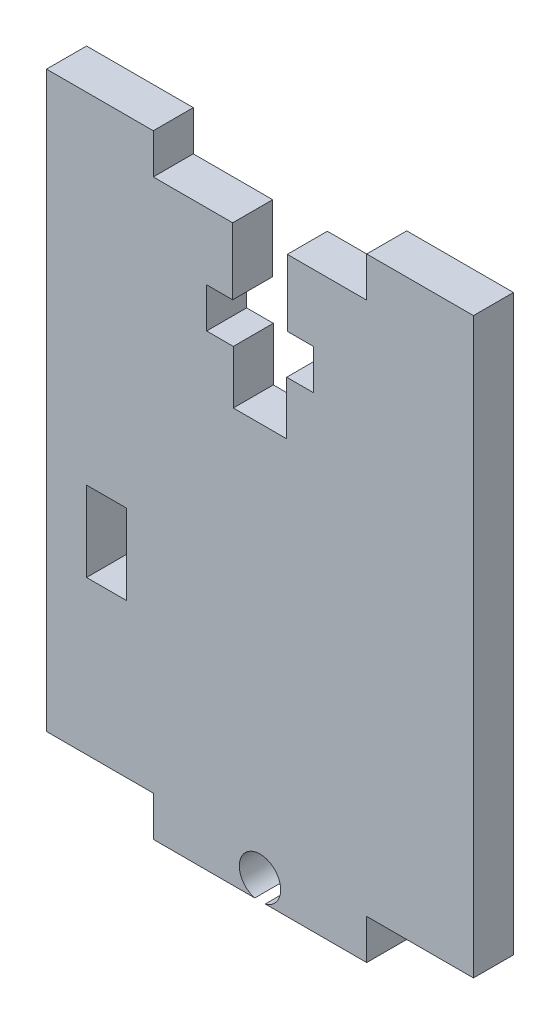
ISO-10303-21;
HEADER;
FILE_DESCRIPTION(('STEP AP214'),'2;1');
FILE_NAME('part.step','',(''),(''),'','','');
FILE_SCHEMA(('AUTOMOTIVE_DESIGN { 1 0 10303 214 1 1 1 1 }'));
ENDSEC;
DATA;
#1=APPLICATION_CONTEXT('core data for automotive mechanical design processes');
#2=APPLICATION_PROTOCOL_DEFINITION('international standard','automotive_design',2000,#1);
#3=PRODUCT_CONTEXT('',#1,'mechanical');
#4=PRODUCT('Part','Part','',(#3));
#5=PRODUCT_RELATED_PRODUCT_CATEGORY('part','',(#4));
#6=PRODUCT_DEFINITION_FORMATION('','',#4);
#7=PRODUCT_DEFINITION_CONTEXT('part definition',#1,'design');
#8=PRODUCT_DEFINITION('design','',#6,#7);
#9=PRODUCT_DEFINITION_SHAPE('','',#8);
#10=(LENGTH_UNIT() NAMED_UNIT(*) SI_UNIT(.MILLI.,.METRE.));
#11=(NAMED_UNIT(*) PLANE_ANGLE_UNIT() SI_UNIT($,.RADIAN.));
#12=(NAMED_UNIT(*) SI_UNIT($,.STERADIAN.) SOLID_ANGLE_UNIT());
#13=UNCERTAINTY_MEASURE_WITH_UNIT(LENGTH_MEASURE(1.E-05),#10,'distance_accuracy_value','');
#14=(GEOMETRIC_REPRESENTATION_CONTEXT(3) GLOBAL_UNCERTAINTY_ASSIGNED_CONTEXT((#13)) GLOBAL_UNIT_ASSIGNED_CONTEXT((#10,
#11,#12)) REPRESENTATION_CONTEXT('',''));
#15=CARTESIAN_POINT('',(0.,0.,0.));
#16=DIRECTION('',(0.,0.,1.));
#17=DIRECTION('',(1.,0.,0.));
#18=AXIS2_PLACEMENT_3D('',#15,#16,#17);
#19=CARTESIAN_POINT('',(0.,7.35530547710422,3.));
#20=DIRECTION('',(0.,0.,1.));
#21=DIRECTION('',(1.,0.,0.));
#22=AXIS2_PLACEMENT_3D('',#19,#20,#21);
#23=PLANE('',#22);
#24=DIRECTION('',(0.,-1.,0.));
#25=VECTOR('',#24,1.);
#26=CARTESIAN_POINT('',(8.,48.8553054771042,3.));
#27=LINE('',#26,#25);
#28=CARTESIAN_POINT('',(8.,51.8553054771042,3.));
#29=VERTEX_POINT('',#28);
#30=CARTESIAN_POINT('',(8.,48.8553054771042,3.));
#31=VERTEX_POINT('',#30);
#32=EDGE_CURVE('E266',#29,#31,#27,.T.);
#33=ORIENTED_EDGE('',*,*,#32,.T.);
#34=DIRECTION('',(-1.,0.,0.));
#35=VECTOR('',#34,1.);
#36=CARTESIAN_POINT('',(2.04789002341845,48.8553054771042,3.));
#37=LINE('',#36,#35);
#38=CARTESIAN_POINT('',(2.04789002341845,48.8553054771042,3.));
#39=VERTEX_POINT('',#38);
#40=EDGE_CURVE('E269',#31,#39,#37,.T.);
#41=ORIENTED_EDGE('',*,*,#40,.T.);
#42=DIRECTION('',(0.,-1.,0.));
#43=VECTOR('',#42,1.);
#44=CARTESIAN_POINT('',(2.04789002341845,48.8553054771042,3.));
#45=LINE('',#44,#43);
#46=CARTESIAN_POINT('',(2.04789002341845,43.8553054771042,3.));
#47=VERTEX_POINT('',#46);
#48=EDGE_CURVE('E272',#39,#47,#45,.T.);
#49=ORIENTED_EDGE('',*,*,#48,.T.);
#50=DIRECTION('',(1.,0.,0.));
#51=VECTOR('',#50,1.);
#52=CARTESIAN_POINT('',(2.04789002341845,43.8553054771042,3.));
#53=LINE('',#52,#51);
#54=CARTESIAN_POINT('',(4.,43.8553054771042,3.));
#55=VERTEX_POINT('',#54);
#56=EDGE_CURVE('E274',#47,#55,#53,.T.);
#57=ORIENTED_EDGE('',*,*,#56,.T.);
#58=DIRECTION('',(0.,-1.,0.));
#59=VECTOR('',#58,1.);
#60=CARTESIAN_POINT('',(4.,43.8553054771042,3.));
#61=LINE('',#60,#59);
#62=CARTESIAN_POINT('',(4.,40.8553054771042,3.));
#63=VERTEX_POINT('',#62);
#64=EDGE_CURVE('E276',#55,#63,#61,.T.);
#65=ORIENTED_EDGE('',*,*,#64,.T.);
#66=DIRECTION('',(-1.,0.,0.));
#67=VECTOR('',#66,1.);
#68=CARTESIAN_POINT('',(4.,40.8553054771042,3.));
#69=LINE('',#68,#67);
#70=CARTESIAN_POINT('',(2.,40.8553054771042,3.));
#71=VERTEX_POINT('',#70);
#72=EDGE_CURVE('E278',#63,#71,#69,.T.);
#73=ORIENTED_EDGE('',*,*,#72,.T.);
#74=DIRECTION('',(0.,-1.,0.));
#75=VECTOR('',#74,1.);
#76=CARTESIAN_POINT('',(2.,40.8553054771042,3.));
#77=LINE('',#76,#75);
#78=CARTESIAN_POINT('',(2.,36.8553054771042,3.));
#79=VERTEX_POINT('',#78);
#80=EDGE_CURVE('E280',#71,#79,#77,.T.);
#81=ORIENTED_EDGE('',*,*,#80,.T.);
#82=DIRECTION('',(-1.,0.,0.));
#83=VECTOR('',#82,1.);
#84=CARTESIAN_POINT('',(2.,36.8553054771042,3.));
#85=LINE('',#84,#83);
#86=CARTESIAN_POINT('',(-2.,36.8553054771042,3.));
#87=VERTEX_POINT('',#86);
#88=EDGE_CURVE('E282',#79,#87,#85,.T.);
#89=ORIENTED_EDGE('',*,*,#88,.T.);
#90=DIRECTION('',(0.,1.,0.));
#91=VECTOR('',#90,1.);
#92=CARTESIAN_POINT('',(-2.,40.8553054771042,3.));
#93=LINE('',#92,#91);
#94=CARTESIAN_POINT('',(-2.,40.8553054771042,3.));
#95=VERTEX_POINT('',#94);
#96=EDGE_CURVE('E284',#87,#95,#93,.T.);
#97=ORIENTED_EDGE('',*,*,#96,.T.);
#98=DIRECTION('',(-1.,0.,0.));
#99=VECTOR('',#98,1.);
#100=CARTESIAN_POINT('',(-4.00000000000001,40.8553054771042,3.));
#101=LINE('',#100,#99);
#102=CARTESIAN_POINT('',(-4.00000000000001,40.8553054771042,3.));
#103=VERTEX_POINT('',#102);
#104=EDGE_CURVE('E286',#95,#103,#101,.T.);
#105=ORIENTED_EDGE('',*,*,#104,.T.);
#106=DIRECTION('',(0.,1.,0.));
#107=VECTOR('',#106,1.);
#108=CARTESIAN_POINT('',(-4.,43.8553054771042,3.));
#109=LINE('',#108,#107);
#110=CARTESIAN_POINT('',(-4.,43.8553054771042,3.));
#111=VERTEX_POINT('',#110);
#112=EDGE_CURVE('E288',#103,#111,#109,.T.);
#113=ORIENTED_EDGE('',*,*,#112,.T.);
#114=DIRECTION('',(1.,0.,0.));
#115=VECTOR('',#114,1.);
#116=CARTESIAN_POINT('',(-2.04789002341846,43.8553054771042,3.));
#117=LINE('',#116,#115);
#118=CARTESIAN_POINT('',(-2.04789002341846,43.8553054771042,3.));
#119=VERTEX_POINT('',#118);
#120=EDGE_CURVE('E290',#111,#119,#117,.T.);
#121=ORIENTED_EDGE('',*,*,#120,.T.);
#122=DIRECTION('',(0.,1.,0.));
#123=VECTOR('',#122,1.);
#124=CARTESIAN_POINT('',(-2.04789002341846,48.8553054771042,3.));
#125=LINE('',#124,#123);
#126=CARTESIAN_POINT('',(-2.04789002341846,48.8553054771042,3.));
#127=VERTEX_POINT('',#126);
#128=EDGE_CURVE('E292',#119,#127,#125,.T.);
#129=ORIENTED_EDGE('',*,*,#128,.T.);
#130=DIRECTION('',(-1.,0.,0.));
#131=VECTOR('',#130,1.);
#132=CARTESIAN_POINT('',(-2.04789002341846,48.8553054771042,3.));
#133=LINE('',#132,#131);
#134=CARTESIAN_POINT('',(-8.00000000000001,48.8553054771042,3.));
#135=VERTEX_POINT('',#134);
#136=EDGE_CURVE('E294',#127,#135,#133,.T.);
#137=ORIENTED_EDGE('',*,*,#136,.T.);
#138=DIRECTION('',(0.,1.,0.));
#139=VECTOR('',#138,1.);
#140=CARTESIAN_POINT('',(-8.00000000000001,48.8553054771042,3.));
#141=LINE('',#140,#139);
#142=CARTESIAN_POINT('',(-8.00000000000001,51.8553054771042,3.));
#143=VERTEX_POINT('',#142);
#144=EDGE_CURVE('E296',#135,#143,#141,.T.);
#145=ORIENTED_EDGE('',*,*,#144,.T.);
#146=DIRECTION('',(-1.,0.,0.));
#147=VECTOR('',#146,1.);
#148=CARTESIAN_POINT('',(-8.00000000000001,51.8553054771042,3.));
#149=LINE('',#148,#147);
#150=CARTESIAN_POINT('',(-16.,51.8553054771042,3.));
#151=VERTEX_POINT('',#150);
#152=EDGE_CURVE('E298',#143,#151,#149,.T.);
#153=ORIENTED_EDGE('',*,*,#152,.T.);
#154=DIRECTION('',(0.,-1.,0.));
#155=VECTOR('',#154,1.);
#156=CARTESIAN_POINT('',(-16.,51.8553054771042,3.));
#157=LINE('',#156,#155);
#158=CARTESIAN_POINT('',(-16.,8.85530547710422,3.));
#159=VERTEX_POINT('',#158);
#160=EDGE_CURVE('E300',#151,#159,#157,.T.);
#161=ORIENTED_EDGE('',*,*,#160,.T.);
#162=DIRECTION('',(1.,0.,0.));
#163=VECTOR('',#162,1.);
#164=CARTESIAN_POINT('',(-16.,8.85530547710422,3.));
#165=LINE('',#164,#163);
#166=CARTESIAN_POINT('',(-8.00000000000001,8.85530547710422,3.));
#167=VERTEX_POINT('',#166);
#168=EDGE_CURVE('E302',#159,#167,#165,.T.);
#169=ORIENTED_EDGE('',*,*,#168,.T.);
#170=DIRECTION('',(0.,-1.,0.));
#171=VECTOR('',#170,1.);
#172=CARTESIAN_POINT('',(-8.00000000000001,5.85530547710422,3.));
#173=LINE('',#172,#171);
#174=CARTESIAN_POINT('',(-8.00000000000001,5.85530547710422,3.));
#175=VERTEX_POINT('',#174);
#176=EDGE_CURVE('E304',#167,#175,#173,.T.);
#177=ORIENTED_EDGE('',*,*,#176,.T.);
#178=DIRECTION('',(1.,0.,0.));
#179=VECTOR('',#178,1.);
#180=CARTESIAN_POINT('',(-8.00000000000001,5.85530547710422,3.));
#181=LINE('',#180,#179);
#182=CARTESIAN_POINT('',(-0.390512483795329,5.85530547710422,3.));
#183=VERTEX_POINT('',#182);
#184=EDGE_CURVE('E306',#175,#183,#181,.T.);
#185=ORIENTED_EDGE('',*,*,#184,.T.);
#186=CARTESIAN_POINT('',(0.,7.35530547710422,3.));
#187=DIRECTION('',(0.,0.,-1.));
#188=DIRECTION('',(1.,0.,0.));
#189=AXIS2_PLACEMENT_3D('',#186,#187,#188);
#190=CIRCLE('',#189,1.55);
#191=CARTESIAN_POINT('',(0.390512483795352,5.85530547710422,3.));
#192=VERTEX_POINT('',#191);
#193=EDGE_CURVE('E308',#183,#192,#190,.T.);
#194=ORIENTED_EDGE('',*,*,#193,.T.);
#195=DIRECTION('',(1.,0.,0.));
#196=VECTOR('',#195,1.);
#197=CARTESIAN_POINT('',(0.390512483795352,5.85530547710422,3.));
#198=LINE('',#197,#196);
#199=CARTESIAN_POINT('',(8.00000000000004,5.85530547710422,3.));
#200=VERTEX_POINT('',#199);
#201=EDGE_CURVE('E310',#192,#200,#198,.T.);
#202=ORIENTED_EDGE('',*,*,#201,.T.);
#203=DIRECTION('',(0.,1.,0.));
#204=VECTOR('',#203,1.);
#205=CARTESIAN_POINT('',(8.00000000000004,5.85530547710422,3.));
#206=LINE('',#205,#204);
#207=CARTESIAN_POINT('',(8.00000000000004,8.85530547710422,3.));
#208=VERTEX_POINT('',#207);
#209=EDGE_CURVE('E312',#200,#208,#206,.T.);
#210=ORIENTED_EDGE('',*,*,#209,.T.);
#211=DIRECTION('',(1.,0.,0.));
#212=VECTOR('',#211,1.);
#213=CARTESIAN_POINT('',(16.,8.85530547710422,3.));
#214=LINE('',#213,#212);
#215=CARTESIAN_POINT('',(16.,8.85530547710422,3.));
#216=VERTEX_POINT('',#215);
#217=EDGE_CURVE('E314',#208,#216,#214,.T.);
#218=ORIENTED_EDGE('',*,*,#217,.T.);
#219=DIRECTION('',(0.,1.,0.));
#220=VECTOR('',#219,1.);
#221=CARTESIAN_POINT('',(16.,51.8553054771042,3.));
#222=LINE('',#221,#220);
#223=CARTESIAN_POINT('',(16.,51.8553054771042,3.));
#224=VERTEX_POINT('',#223);
#225=EDGE_CURVE('E316',#216,#224,#222,.T.);
#226=ORIENTED_EDGE('',*,*,#225,.T.);
#227=DIRECTION('',(-1.,0.,0.));
#228=VECTOR('',#227,1.);
#229=CARTESIAN_POINT('',(8.,51.8553054771042,3.));
#230=LINE('',#229,#228);
#231=EDGE_CURVE('E318',#224,#29,#230,.T.);
#232=ORIENTED_EDGE('',*,*,#231,.T.);
#233=EDGE_LOOP('',(#33,#41,#49,#57,#65,#73,#81,#89,#97,#105,#113,#121,#129,#137,#145,#153,#161,
#169,#177,#185,#194,#202,#210,#218,#226,#232));
#234=FACE_BOUND('',#233,.T.);
#235=DIRECTION('',(1.,0.,0.));
#236=VECTOR('',#235,1.);
#237=CARTESIAN_POINT('',(-13.,20.3553054771042,3.));
#238=LINE('',#237,#236);
#239=CARTESIAN_POINT('',(-13.,20.3553054771042,3.));
#240=VERTEX_POINT('',#239);
#241=CARTESIAN_POINT('',(-9.99999999999999,20.3553054771042,3.));
#242=VERTEX_POINT('',#241);
#243=EDGE_CURVE('E238',#240,#242,#238,.T.);
#244=ORIENTED_EDGE('',*,*,#243,.F.);
#245=DIRECTION('',(0.,-1.,0.));
#246=VECTOR('',#245,1.);
#247=CARTESIAN_POINT('',(-13.,20.3553054771042,3.));
#248=LINE('',#247,#246);
#249=CARTESIAN_POINT('',(-13.,26.3553054771042,3.));
#250=VERTEX_POINT('',#249);
#251=EDGE_CURVE('E230',#250,#240,#248,.T.);
#252=ORIENTED_EDGE('',*,*,#251,.F.);
#253=DIRECTION('',(-1.,0.,0.));
#254=VECTOR('',#253,1.);
#255=CARTESIAN_POINT('',(-13.,26.3553054771042,3.));
#256=LINE('',#255,#254);
#257=CARTESIAN_POINT('',(-9.99999999999999,26.3553054771042,3.));
#258=VERTEX_POINT('',#257);
#259=EDGE_CURVE('E252',#258,#250,#256,.T.);
#260=ORIENTED_EDGE('',*,*,#259,.F.);
#261=DIRECTION('',(0.,1.,0.));
#262=VECTOR('',#261,1.);
#263=CARTESIAN_POINT('',(-9.99999999999999,20.3553054771042,3.));
#264=LINE('',#263,#262);
#265=EDGE_CURVE('E250',#242,#258,#264,.T.);
#266=ORIENTED_EDGE('',*,*,#265,.F.);
#267=EDGE_LOOP('',(#244,#252,#260,#266));
#268=FACE_BOUND('',#267,.T.);
#269=ADVANCED_FACE('F33',(#234,#268),#23,.T.);
#270=CARTESIAN_POINT('',(0.,7.35530547710422,0.));
#271=DIRECTION('',(0.,0.,1.));
#272=DIRECTION('',(1.,0.,0.));
#273=AXIS2_PLACEMENT_3D('',#270,#271,#272);
#274=PLANE('',#273);
#275=DIRECTION('',(0.,-1.,0.));
#276=VECTOR('',#275,1.);
#277=CARTESIAN_POINT('',(8.,48.8553054771042,0.));
#278=LINE('',#277,#276);
#279=CARTESIAN_POINT('',(8.,51.8553054771042,0.));
#280=VERTEX_POINT('',#279);
#281=CARTESIAN_POINT('',(8.,48.8553054771042,0.));
#282=VERTEX_POINT('',#281);
#283=EDGE_CURVE('E246',#280,#282,#278,.T.);
#284=ORIENTED_EDGE('',*,*,#283,.F.);
#285=DIRECTION('',(-1.,0.,0.));
#286=VECTOR('',#285,1.);
#287=CARTESIAN_POINT('',(8.,51.8553054771042,0.));
#288=LINE('',#287,#286);
#289=CARTESIAN_POINT('',(16.,51.8553054771042,0.));
#290=VERTEX_POINT('',#289);
#291=EDGE_CURVE('E270',#290,#280,#288,.T.);
#292=ORIENTED_EDGE('',*,*,#291,.F.);
#293=DIRECTION('',(0.,1.,0.));
#294=VECTOR('',#293,1.);
#295=CARTESIAN_POINT('',(16.,51.8553054771042,0.));
#296=LINE('',#295,#294);
#297=CARTESIAN_POINT('',(16.,8.85530547710422,0.));
#298=VERTEX_POINT('',#297);
#299=EDGE_CURVE('E369',#298,#290,#296,.T.);
#300=ORIENTED_EDGE('',*,*,#299,.F.);
#301=DIRECTION('',(1.,0.,0.));
#302=VECTOR('',#301,1.);
#303=CARTESIAN_POINT('',(16.,8.85530547710422,0.));
#304=LINE('',#303,#302);
#305=CARTESIAN_POINT('',(8.00000000000004,8.85530547710422,0.));
#306=VERTEX_POINT('',#305);
#307=EDGE_CURVE('E367',#306,#298,#304,.T.);
#308=ORIENTED_EDGE('',*,*,#307,.F.);
#309=DIRECTION('',(0.,1.,0.));
#310=VECTOR('',#309,1.);
#311=CARTESIAN_POINT('',(8.00000000000004,5.85530547710422,0.));
#312=LINE('',#311,#310);
#313=CARTESIAN_POINT('',(8.00000000000004,5.85530547710422,0.));
#314=VERTEX_POINT('',#313);
#315=EDGE_CURVE('E365',#314,#306,#312,.T.);
#316=ORIENTED_EDGE('',*,*,#315,.F.);
#317=DIRECTION('',(1.,0.,0.));
#318=VECTOR('',#317,1.);
#319=CARTESIAN_POINT('',(0.390512483795352,5.85530547710422,0.));
#320=LINE('',#319,#318);
#321=CARTESIAN_POINT('',(0.390512483795352,5.85530547710422,0.));
#322=VERTEX_POINT('',#321);
#323=EDGE_CURVE('E363',#322,#314,#320,.T.);
#324=ORIENTED_EDGE('',*,*,#323,.F.);
#325=CARTESIAN_POINT('',(0.,7.35530547710422,0.));
#326=DIRECTION('',(0.,0.,-1.));
#327=DIRECTION('',(1.,0.,0.));
#328=AXIS2_PLACEMENT_3D('',#325,#326,#327);
#329=CIRCLE('',#328,1.55);
#330=CARTESIAN_POINT('',(-0.390512483795329,5.85530547710422,0.));
#331=VERTEX_POINT('',#330);
#332=EDGE_CURVE('E361',#331,#322,#329,.T.);
#333=ORIENTED_EDGE('',*,*,#332,.F.);
#334=DIRECTION('',(1.,0.,0.));
#335=VECTOR('',#334,1.);
#336=CARTESIAN_POINT('',(-8.00000000000001,5.85530547710422,0.));
#337=LINE('',#336,#335);
#338=CARTESIAN_POINT('',(-8.00000000000001,5.85530547710422,0.));
#339=VERTEX_POINT('',#338);
#340=EDGE_CURVE('E359',#339,#331,#337,.T.);
#341=ORIENTED_EDGE('',*,*,#340,.F.);
#342=DIRECTION('',(0.,-1.,0.));
#343=VECTOR('',#342,1.);
#344=CARTESIAN_POINT('',(-8.00000000000001,5.85530547710422,0.));
#345=LINE('',#344,#343);
#346=CARTESIAN_POINT('',(-8.00000000000001,8.85530547710422,0.));
#347=VERTEX_POINT('',#346);
#348=EDGE_CURVE('E357',#347,#339,#345,.T.);
#349=ORIENTED_EDGE('',*,*,#348,.F.);
#350=DIRECTION('',(1.,0.,0.));
#351=VECTOR('',#350,1.);
#352=CARTESIAN_POINT('',(-16.,8.85530547710422,0.));
#353=LINE('',#352,#351);
#354=CARTESIAN_POINT('',(-16.,8.85530547710422,0.));
#355=VERTEX_POINT('',#354);
#356=EDGE_CURVE('E355',#355,#347,#353,.T.);
#357=ORIENTED_EDGE('',*,*,#356,.F.);
#358=DIRECTION('',(0.,-1.,0.));
#359=VECTOR('',#358,1.);
#360=CARTESIAN_POINT('',(-16.,51.8553054771042,0.));
#361=LINE('',#360,#359);
#362=CARTESIAN_POINT('',(-16.,51.8553054771042,0.));
#363=VERTEX_POINT('',#362);
#364=EDGE_CURVE('E353',#363,#355,#361,.T.);
#365=ORIENTED_EDGE('',*,*,#364,.F.);
#366=DIRECTION('',(-1.,0.,0.));
#367=VECTOR('',#366,1.);
#368=CARTESIAN_POINT('',(-8.00000000000001,51.8553054771042,0.));
#369=LINE('',#368,#367);
#370=CARTESIAN_POINT('',(-8.00000000000001,51.8553054771042,0.));
#371=VERTEX_POINT('',#370);
#372=EDGE_CURVE('E351',#371,#363,#369,.T.);
#373=ORIENTED_EDGE('',*,*,#372,.F.);
#374=DIRECTION('',(0.,1.,0.));
#375=VECTOR('',#374,1.);
#376=CARTESIAN_POINT('',(-8.00000000000001,48.8553054771042,0.));
#377=LINE('',#376,#375);
#378=CARTESIAN_POINT('',(-8.00000000000001,48.8553054771042,0.));
#379=VERTEX_POINT('',#378);
#380=EDGE_CURVE('E349',#379,#371,#377,.T.);
#381=ORIENTED_EDGE('',*,*,#380,.F.);
#382=DIRECTION('',(-1.,0.,0.));
#383=VECTOR('',#382,1.);
#384=CARTESIAN_POINT('',(-2.04789002341846,48.8553054771042,0.));
#385=LINE('',#384,#383);
#386=CARTESIAN_POINT('',(-2.04789002341846,48.8553054771042,0.));
#387=VERTEX_POINT('',#386);
#388=EDGE_CURVE('E347',#387,#379,#385,.T.);
#389=ORIENTED_EDGE('',*,*,#388,.F.);
#390=DIRECTION('',(0.,1.,0.));
#391=VECTOR('',#390,1.);
#392=CARTESIAN_POINT('',(-2.04789002341846,48.8553054771042,0.));
#393=LINE('',#392,#391);
#394=CARTESIAN_POINT('',(-2.04789002341846,43.8553054771042,0.));
#395=VERTEX_POINT('',#394);
#396=EDGE_CURVE('E345',#395,#387,#393,.T.);
#397=ORIENTED_EDGE('',*,*,#396,.F.);
#398=DIRECTION('',(1.,0.,0.));
#399=VECTOR('',#398,1.);
#400=CARTESIAN_POINT('',(-2.04789002341846,43.8553054771042,0.));
#401=LINE('',#400,#399);
#402=CARTESIAN_POINT('',(-4.,43.8553054771042,0.));
#403=VERTEX_POINT('',#402);
#404=EDGE_CURVE('E343',#403,#395,#401,.T.);
#405=ORIENTED_EDGE('',*,*,#404,.F.);
#406=DIRECTION('',(0.,1.,0.));
#407=VECTOR('',#406,1.);
#408=CARTESIAN_POINT('',(-4.,43.8553054771042,0.));
#409=LINE('',#408,#407);
#410=CARTESIAN_POINT('',(-4.00000000000001,40.8553054771042,0.));
#411=VERTEX_POINT('',#410);
#412=EDGE_CURVE('E341',#411,#403,#409,.T.);
#413=ORIENTED_EDGE('',*,*,#412,.F.);
#414=DIRECTION('',(-1.,0.,0.));
#415=VECTOR('',#414,1.);
#416=CARTESIAN_POINT('',(-4.00000000000001,40.8553054771042,0.));
#417=LINE('',#416,#415);
#418=CARTESIAN_POINT('',(-2.,40.8553054771042,0.));
#419=VERTEX_POINT('',#418);
#420=EDGE_CURVE('E339',#419,#411,#417,.T.);
#421=ORIENTED_EDGE('',*,*,#420,.F.);
#422=DIRECTION('',(0.,1.,0.));
#423=VECTOR('',#422,1.);
#424=CARTESIAN_POINT('',(-2.,40.8553054771042,0.));
#425=LINE('',#424,#423);
#426=CARTESIAN_POINT('',(-2.,36.8553054771042,0.));
#427=VERTEX_POINT('',#426);
#428=EDGE_CURVE('E337',#427,#419,#425,.T.);
#429=ORIENTED_EDGE('',*,*,#428,.F.);
#430=DIRECTION('',(-1.,0.,0.));
#431=VECTOR('',#430,1.);
#432=CARTESIAN_POINT('',(2.,36.8553054771042,0.));
#433=LINE('',#432,#431);
#434=CARTESIAN_POINT('',(2.,36.8553054771042,0.));
#435=VERTEX_POINT('',#434);
#436=EDGE_CURVE('E335',#435,#427,#433,.T.);
#437=ORIENTED_EDGE('',*,*,#436,.F.);
#438=DIRECTION('',(0.,-1.,0.));
#439=VECTOR('',#438,1.);
#440=CARTESIAN_POINT('',(2.,40.8553054771042,0.));
#441=LINE('',#440,#439);
#442=CARTESIAN_POINT('',(2.,40.8553054771042,0.));
#443=VERTEX_POINT('',#442);
#444=EDGE_CURVE('E333',#443,#435,#441,.T.);
#445=ORIENTED_EDGE('',*,*,#444,.F.);
#446=DIRECTION('',(-1.,0.,0.));
#447=VECTOR('',#446,1.);
#448=CARTESIAN_POINT('',(4.,40.8553054771042,0.));
#449=LINE('',#448,#447);
#450=CARTESIAN_POINT('',(4.,40.8553054771042,0.));
#451=VERTEX_POINT('',#450);
#452=EDGE_CURVE('E331',#451,#443,#449,.T.);
#453=ORIENTED_EDGE('',*,*,#452,.F.);
#454=DIRECTION('',(0.,-1.,0.));
#455=VECTOR('',#454,1.);
#456=CARTESIAN_POINT('',(4.,43.8553054771042,0.));
#457=LINE('',#456,#455);
#458=CARTESIAN_POINT('',(4.,43.8553054771042,0.));
#459=VERTEX_POINT('',#458);
#460=EDGE_CURVE('E329',#459,#451,#457,.T.);
#461=ORIENTED_EDGE('',*,*,#460,.F.);
#462=DIRECTION('',(1.,0.,0.));
#463=VECTOR('',#462,1.);
#464=CARTESIAN_POINT('',(2.04789002341845,43.8553054771042,0.));
#465=LINE('',#464,#463);
#466=CARTESIAN_POINT('',(2.04789002341845,43.8553054771042,0.));
#467=VERTEX_POINT('',#466);
#468=EDGE_CURVE('E327',#467,#459,#465,.T.);
#469=ORIENTED_EDGE('',*,*,#468,.F.);
#470=DIRECTION('',(0.,-1.,0.));
#471=VECTOR('',#470,1.);
#472=CARTESIAN_POINT('',(2.04789002341845,48.8553054771042,0.));
#473=LINE('',#472,#471);
#474=CARTESIAN_POINT('',(2.04789002341845,48.8553054771042,0.));
#475=VERTEX_POINT('',#474);
#476=EDGE_CURVE('E325',#475,#467,#473,.T.);
#477=ORIENTED_EDGE('',*,*,#476,.F.);
#478=DIRECTION('',(-1.,0.,0.));
#479=VECTOR('',#478,1.);
#480=CARTESIAN_POINT('',(2.04789002341845,48.8553054771042,0.));
#481=LINE('',#480,#479);
#482=EDGE_CURVE('E323',#282,#475,#481,.T.);
#483=ORIENTED_EDGE('',*,*,#482,.F.);
#484=EDGE_LOOP('',(#284,#292,#300,#308,#316,#324,#333,#341,#349,#357,#365,#373,#381,#389,#397,
#405,#413,#421,#429,#437,#445,#453,#461,#469,#477,#483));
#485=FACE_BOUND('',#484,.T.);
#486=DIRECTION('',(0.,-1.,0.));
#487=VECTOR('',#486,1.);
#488=CARTESIAN_POINT('',(-13.,20.3553054771042,0.));
#489=LINE('',#488,#487);
#490=CARTESIAN_POINT('',(-13.,26.3553054771042,0.));
#491=VERTEX_POINT('',#490);
#492=CARTESIAN_POINT('',(-13.,20.3553054771042,0.));
#493=VERTEX_POINT('',#492);
#494=EDGE_CURVE('E56',#491,#493,#489,.T.);
#495=ORIENTED_EDGE('',*,*,#494,.T.);
#496=DIRECTION('',(1.,0.,0.));
#497=VECTOR('',#496,1.);
#498=CARTESIAN_POINT('',(-13.,20.3553054771042,0.));
#499=LINE('',#498,#497);
#500=CARTESIAN_POINT('',(-9.99999999999999,20.3553054771042,0.));
#501=VERTEX_POINT('',#500);
#502=EDGE_CURVE('E245',#493,#501,#499,.T.);
#503=ORIENTED_EDGE('',*,*,#502,.T.);
#504=DIRECTION('',(0.,1.,0.));
#505=VECTOR('',#504,1.);
#506=CARTESIAN_POINT('',(-9.99999999999999,20.3553054771042,0.));
#507=LINE('',#506,#505);
#508=CARTESIAN_POINT('',(-9.99999999999999,26.3553054771042,0.));
#509=VERTEX_POINT('',#508);
#510=EDGE_CURVE('E258',#501,#509,#507,.T.);
#511=ORIENTED_EDGE('',*,*,#510,.T.);
#512=DIRECTION('',(-1.,0.,0.));
#513=VECTOR('',#512,1.);
#514=CARTESIAN_POINT('',(-13.,26.3553054771042,0.));
#515=LINE('',#514,#513);
#516=EDGE_CURVE('E239',#509,#491,#515,.T.);
#517=ORIENTED_EDGE('',*,*,#516,.T.);
#518=EDGE_LOOP('',(#495,#503,#511,#517));
#519=FACE_BOUND('',#518,.T.);
#520=ADVANCED_FACE('F453',(#485,#519),#274,.F.);
#521=CARTESIAN_POINT('',(8.,48.8553054771042,3.));
#522=DIRECTION('',(1.,0.,0.));
#523=DIRECTION('',(0.,0.,-1.));
#524=AXIS2_PLACEMENT_3D('',#521,#522,#523);
#525=PLANE('',#524);
#526=ORIENTED_EDGE('',*,*,#283,.T.);
#527=DIRECTION('',(0.,0.,-1.));
#528=VECTOR('',#527,1.);
#529=CARTESIAN_POINT('',(8.,48.8553054771042,3.));
#530=LINE('',#529,#528);
#531=EDGE_CURVE('E11',#31,#282,#530,.T.);
#532=ORIENTED_EDGE('',*,*,#531,.F.);
#533=ORIENTED_EDGE('',*,*,#32,.F.);
#534=DIRECTION('',(0.,0.,-1.));
#535=VECTOR('',#534,1.);
#536=CARTESIAN_POINT('',(8.,51.8553054771042,3.));
#537=LINE('',#536,#535);
#538=EDGE_CURVE('E320',#29,#280,#537,.T.);
#539=ORIENTED_EDGE('',*,*,#538,.T.);
#540=EDGE_LOOP('',(#526,#532,#533,#539));
#541=FACE_BOUND('',#540,.T.);
#542=ADVANCED_FACE('F35',(#541),#525,.F.);
#543=CARTESIAN_POINT('',(2.04789002341845,48.8553054771042,3.));
#544=DIRECTION('',(0.,-1.,0.));
#545=DIRECTION('',(0.,0.,-1.));
#546=AXIS2_PLACEMENT_3D('',#543,#544,#545);
#547=PLANE('',#546);
#548=ORIENTED_EDGE('',*,*,#482,.T.);
#549=DIRECTION('',(0.,0.,-1.));
#550=VECTOR('',#549,1.);
#551=CARTESIAN_POINT('',(2.04789002341845,48.8553054771042,3.));
#552=LINE('',#551,#550);
#553=EDGE_CURVE('E41',#39,#475,#552,.T.);
#554=ORIENTED_EDGE('',*,*,#553,.F.);
#555=ORIENTED_EDGE('',*,*,#40,.F.);
#556=ORIENTED_EDGE('',*,*,#531,.T.);
#557=EDGE_LOOP('',(#548,#554,#555,#556));
#558=FACE_BOUND('',#557,.T.);
#559=ADVANCED_FACE('F470',(#558),#547,.F.);
#560=CARTESIAN_POINT('',(2.04789002341845,48.8553054771042,3.));
#561=DIRECTION('',(1.,0.,0.));
#562=DIRECTION('',(0.,1.,0.));
#563=AXIS2_PLACEMENT_3D('',#560,#561,#562);
#564=PLANE('',#563);
#565=ORIENTED_EDGE('',*,*,#476,.T.);
#566=DIRECTION('',(0.,0.,-1.));
#567=VECTOR('',#566,1.);
#568=CARTESIAN_POINT('',(2.04789002341845,43.8553054771042,3.));
#569=LINE('',#568,#567);
#570=EDGE_CURVE('E440',#47,#467,#569,.T.);
#571=ORIENTED_EDGE('',*,*,#570,.F.);
#572=ORIENTED_EDGE('',*,*,#48,.F.);
#573=ORIENTED_EDGE('',*,*,#553,.T.);
#574=EDGE_LOOP('',(#565,#571,#572,#573));
#575=FACE_BOUND('',#574,.T.);
#576=ADVANCED_FACE('F447',(#575),#564,.F.);
#577=CARTESIAN_POINT('',(2.04789002341845,43.8553054771042,3.));
#578=DIRECTION('',(0.,1.,0.));
#579=DIRECTION('',(-1.,0.,0.));
#580=AXIS2_PLACEMENT_3D('',#577,#578,#579);
#581=PLANE('',#580);
#582=ORIENTED_EDGE('',*,*,#468,.T.);
#583=DIRECTION('',(0.,0.,-1.));
#584=VECTOR('',#583,1.);
#585=CARTESIAN_POINT('',(4.,43.8553054771042,3.));
#586=LINE('',#585,#584);
#587=EDGE_CURVE('E437',#55,#459,#586,.T.);
#588=ORIENTED_EDGE('',*,*,#587,.F.);
#589=ORIENTED_EDGE('',*,*,#56,.F.);
#590=ORIENTED_EDGE('',*,*,#570,.T.);
#591=EDGE_LOOP('',(#582,#588,#589,#590));
#592=FACE_BOUND('',#591,.T.);
#593=ADVANCED_FACE('F459',(#592),#581,.F.);
#594=CARTESIAN_POINT('',(4.,43.8553054771042,3.));
#595=DIRECTION('',(1.,0.,0.));
#596=DIRECTION('',(0.,1.,0.));
#597=AXIS2_PLACEMENT_3D('',#594,#595,#596);
#598=PLANE('',#597);
#599=ORIENTED_EDGE('',*,*,#460,.T.);
#600=DIRECTION('',(0.,0.,-1.));
#601=VECTOR('',#600,1.);
#602=CARTESIAN_POINT('',(4.,40.8553054771042,3.));
#603=LINE('',#602,#601);
#604=EDGE_CURVE('E434',#63,#451,#603,.T.);
#605=ORIENTED_EDGE('',*,*,#604,.F.);
#606=ORIENTED_EDGE('',*,*,#64,.F.);
#607=ORIENTED_EDGE('',*,*,#587,.T.);
#608=EDGE_LOOP('',(#599,#605,#606,#607));
#609=FACE_BOUND('',#608,.T.);
#610=ADVANCED_FACE('F463',(#609),#598,.F.);
#611=CARTESIAN_POINT('',(4.,40.8553054771042,3.));
#612=DIRECTION('',(0.,-1.,0.));
#613=DIRECTION('',(0.,0.,-1.));
#614=AXIS2_PLACEMENT_3D('',#611,#612,#613);
#615=PLANE('',#614);
#616=ORIENTED_EDGE('',*,*,#452,.T.);
#617=DIRECTION('',(0.,0.,-1.));
#618=VECTOR('',#617,1.);
#619=CARTESIAN_POINT('',(2.,40.8553054771042,3.));
#620=LINE('',#619,#618);
#621=EDGE_CURVE('E431',#71,#443,#620,.T.);
#622=ORIENTED_EDGE('',*,*,#621,.F.);
#623=ORIENTED_EDGE('',*,*,#72,.F.);
#624=ORIENTED_EDGE('',*,*,#604,.T.);
#625=EDGE_LOOP('',(#616,#622,#623,#624));
#626=FACE_BOUND('',#625,.T.);
#627=ADVANCED_FACE('F573',(#626),#615,.F.);
#628=CARTESIAN_POINT('',(2.,40.8553054771042,3.));
#629=DIRECTION('',(1.,0.,0.));
#630=DIRECTION('',(0.,1.,0.));
#631=AXIS2_PLACEMENT_3D('',#628,#629,#630);
#632=PLANE('',#631);
#633=ORIENTED_EDGE('',*,*,#444,.T.);
#634=DIRECTION('',(0.,0.,-1.));
#635=VECTOR('',#634,1.);
#636=CARTESIAN_POINT('',(2.,36.8553054771042,3.));
#637=LINE('',#636,#635);
#638=EDGE_CURVE('E428',#79,#435,#637,.T.);
#639=ORIENTED_EDGE('',*,*,#638,.F.);
#640=ORIENTED_EDGE('',*,*,#80,.F.);
#641=ORIENTED_EDGE('',*,*,#621,.T.);
#642=EDGE_LOOP('',(#633,#639,#640,#641));
#643=FACE_BOUND('',#642,.T.);
#644=ADVANCED_FACE('F571',(#643),#632,.F.);
#645=CARTESIAN_POINT('',(2.,36.8553054771042,3.));
#646=DIRECTION('',(0.,-1.,0.));
#647=DIRECTION('',(0.,0.,-1.));
#648=AXIS2_PLACEMENT_3D('',#645,#646,#647);
#649=PLANE('',#648);
#650=ORIENTED_EDGE('',*,*,#436,.T.);
#651=DIRECTION('',(0.,0.,-1.));
#652=VECTOR('',#651,1.);
#653=CARTESIAN_POINT('',(-2.,36.8553054771042,3.));
#654=LINE('',#653,#652);
#655=EDGE_CURVE('E425',#87,#427,#654,.T.);
#656=ORIENTED_EDGE('',*,*,#655,.F.);
#657=ORIENTED_EDGE('',*,*,#88,.F.);
#658=ORIENTED_EDGE('',*,*,#638,.T.);
#659=EDGE_LOOP('',(#650,#656,#657,#658));
#660=FACE_BOUND('',#659,.T.);
#661=ADVANCED_FACE('F566',(#660),#649,.F.);
#662=CARTESIAN_POINT('',(-2.,40.8553054771042,3.));
#663=DIRECTION('',(-1.,0.,0.));
#664=DIRECTION('',(0.,-1.,0.));
#665=AXIS2_PLACEMENT_3D('',#662,#663,#664);
#666=PLANE('',#665);
#667=ORIENTED_EDGE('',*,*,#428,.T.);
#668=DIRECTION('',(0.,0.,-1.));
#669=VECTOR('',#668,1.);
#670=CARTESIAN_POINT('',(-2.,40.8553054771042,3.));
#671=LINE('',#670,#669);
#672=EDGE_CURVE('E422',#95,#419,#671,.T.);
#673=ORIENTED_EDGE('',*,*,#672,.F.);
#674=ORIENTED_EDGE('',*,*,#96,.F.);
#675=ORIENTED_EDGE('',*,*,#655,.T.);
#676=EDGE_LOOP('',(#667,#673,#674,#675));
#677=FACE_BOUND('',#676,.T.);
#678=ADVANCED_FACE('F561',(#677),#666,.F.);
#679=CARTESIAN_POINT('',(-4.00000000000001,40.8553054771042,3.));
#680=DIRECTION('',(0.,-1.,0.));
#681=DIRECTION('',(0.,0.,-1.));
#682=AXIS2_PLACEMENT_3D('',#679,#680,#681);
#683=PLANE('',#682);
#684=ORIENTED_EDGE('',*,*,#420,.T.);
#685=DIRECTION('',(0.,0.,-1.));
#686=VECTOR('',#685,1.);
#687=CARTESIAN_POINT('',(-4.00000000000001,40.8553054771042,3.));
#688=LINE('',#687,#686);
#689=EDGE_CURVE('E419',#103,#411,#688,.T.);
#690=ORIENTED_EDGE('',*,*,#689,.F.);
#691=ORIENTED_EDGE('',*,*,#104,.F.);
#692=ORIENTED_EDGE('',*,*,#672,.T.);
#693=EDGE_LOOP('',(#684,#690,#691,#692));
#694=FACE_BOUND('',#693,.T.);
#695=ADVANCED_FACE('F557',(#694),#683,.F.);
#696=CARTESIAN_POINT('',(-4.,43.8553054771042,3.));
#697=DIRECTION('',(-1.,0.,0.));
#698=DIRECTION('',(0.,-1.,0.));
#699=AXIS2_PLACEMENT_3D('',#696,#697,#698);
#700=PLANE('',#699);
#701=ORIENTED_EDGE('',*,*,#412,.T.);
#702=DIRECTION('',(0.,0.,-1.));
#703=VECTOR('',#702,1.);
#704=CARTESIAN_POINT('',(-4.,43.8553054771042,3.));
#705=LINE('',#704,#703);
#706=EDGE_CURVE('E416',#111,#403,#705,.T.);
#707=ORIENTED_EDGE('',*,*,#706,.F.);
#708=ORIENTED_EDGE('',*,*,#112,.F.);
#709=ORIENTED_EDGE('',*,*,#689,.T.);
#710=EDGE_LOOP('',(#701,#707,#708,#709));
#711=FACE_BOUND('',#710,.T.);
#712=ADVANCED_FACE('F552',(#711),#700,.F.);
#713=CARTESIAN_POINT('',(-2.04789002341846,43.8553054771042,3.));
#714=DIRECTION('',(0.,1.,0.));
#715=DIRECTION('',(-1.,0.,0.));
#716=AXIS2_PLACEMENT_3D('',#713,#714,#715);
#717=PLANE('',#716);
#718=ORIENTED_EDGE('',*,*,#404,.T.);
#719=DIRECTION('',(0.,0.,-1.));
#720=VECTOR('',#719,1.);
#721=CARTESIAN_POINT('',(-2.04789002341846,43.8553054771042,3.));
#722=LINE('',#721,#720);
#723=EDGE_CURVE('E413',#119,#395,#722,.T.);
#724=ORIENTED_EDGE('',*,*,#723,.F.);
#725=ORIENTED_EDGE('',*,*,#120,.F.);
#726=ORIENTED_EDGE('',*,*,#706,.T.);
#727=EDGE_LOOP('',(#718,#724,#725,#726));
#728=FACE_BOUND('',#727,.T.);
#729=ADVANCED_FACE('F546',(#728),#717,.F.);
#730=CARTESIAN_POINT('',(-2.04789002341846,48.8553054771042,3.));
#731=DIRECTION('',(-1.,0.,0.));
#732=DIRECTION('',(0.,-1.,0.));
#733=AXIS2_PLACEMENT_3D('',#730,#731,#732);
#734=PLANE('',#733);
#735=ORIENTED_EDGE('',*,*,#396,.T.);
#736=DIRECTION('',(0.,0.,-1.));
#737=VECTOR('',#736,1.);
#738=CARTESIAN_POINT('',(-2.04789002341846,48.8553054771042,3.));
#739=LINE('',#738,#737);
#740=EDGE_CURVE('E410',#127,#387,#739,.T.);
#741=ORIENTED_EDGE('',*,*,#740,.F.);
#742=ORIENTED_EDGE('',*,*,#128,.F.);
#743=ORIENTED_EDGE('',*,*,#723,.T.);
#744=EDGE_LOOP('',(#735,#741,#742,#743));
#745=FACE_BOUND('',#744,.T.);
#746=ADVANCED_FACE('F542',(#745),#734,.F.);
#747=CARTESIAN_POINT('',(-2.04789002341846,48.8553054771042,3.));
#748=DIRECTION('',(0.,-1.,0.));
#749=DIRECTION('',(0.,0.,-1.));
#750=AXIS2_PLACEMENT_3D('',#747,#748,#749);
#751=PLANE('',#750);
#752=ORIENTED_EDGE('',*,*,#388,.T.);
#753=DIRECTION('',(0.,0.,-1.));
#754=VECTOR('',#753,1.);
#755=CARTESIAN_POINT('',(-8.00000000000001,48.8553054771042,3.));
#756=LINE('',#755,#754);
#757=EDGE_CURVE('E407',#135,#379,#756,.T.);
#758=ORIENTED_EDGE('',*,*,#757,.F.);
#759=ORIENTED_EDGE('',*,*,#136,.F.);
#760=ORIENTED_EDGE('',*,*,#740,.T.);
#761=EDGE_LOOP('',(#752,#758,#759,#760));
#762=FACE_BOUND('',#761,.T.);
#763=ADVANCED_FACE('F537',(#762),#751,.F.);
#764=CARTESIAN_POINT('',(-8.00000000000001,48.8553054771042,3.));
#765=DIRECTION('',(-1.,0.,0.));
#766=DIRECTION('',(0.,0.,1.));
#767=AXIS2_PLACEMENT_3D('',#764,#765,#766);
#768=PLANE('',#767);
#769=ORIENTED_EDGE('',*,*,#380,.T.);
#770=DIRECTION('',(0.,0.,-1.));
#771=VECTOR('',#770,1.);
#772=CARTESIAN_POINT('',(-8.00000000000001,51.8553054771042,3.));
#773=LINE('',#772,#771);
#774=EDGE_CURVE('E404',#143,#371,#773,.T.);
#775=ORIENTED_EDGE('',*,*,#774,.F.);
#776=ORIENTED_EDGE('',*,*,#144,.F.);
#777=ORIENTED_EDGE('',*,*,#757,.T.);
#778=EDGE_LOOP('',(#769,#775,#776,#777));
#779=FACE_BOUND('',#778,.T.);
#780=ADVANCED_FACE('F531',(#779),#768,.F.);
#781=CARTESIAN_POINT('',(-8.00000000000001,51.8553054771042,3.));
#782=DIRECTION('',(0.,-1.,0.));
#783=DIRECTION('',(0.,0.,-1.));
#784=AXIS2_PLACEMENT_3D('',#781,#782,#783);
#785=PLANE('',#784);
#786=ORIENTED_EDGE('',*,*,#372,.T.);
#787=DIRECTION('',(0.,0.,-1.));
#788=VECTOR('',#787,1.);
#789=CARTESIAN_POINT('',(-16.,51.8553054771042,3.));
#790=LINE('',#789,#788);
#791=EDGE_CURVE('E401',#151,#363,#790,.T.);
#792=ORIENTED_EDGE('',*,*,#791,.F.);
#793=ORIENTED_EDGE('',*,*,#152,.F.);
#794=ORIENTED_EDGE('',*,*,#774,.T.);
#795=EDGE_LOOP('',(#786,#792,#793,#794));
#796=FACE_BOUND('',#795,.T.);
#797=ADVANCED_FACE('F527',(#796),#785,.F.);
#798=CARTESIAN_POINT('',(-16.,51.8553054771042,3.));
#799=DIRECTION('',(1.,0.,0.));
#800=DIRECTION('',(0.,1.,0.));
#801=AXIS2_PLACEMENT_3D('',#798,#799,#800);
#802=PLANE('',#801);
#803=ORIENTED_EDGE('',*,*,#364,.T.);
#804=DIRECTION('',(0.,0.,-1.));
#805=VECTOR('',#804,1.);
#806=CARTESIAN_POINT('',(-16.,8.85530547710422,3.));
#807=LINE('',#806,#805);
#808=EDGE_CURVE('E398',#159,#355,#807,.T.);
#809=ORIENTED_EDGE('',*,*,#808,.F.);
#810=ORIENTED_EDGE('',*,*,#160,.F.);
#811=ORIENTED_EDGE('',*,*,#791,.T.);
#812=EDGE_LOOP('',(#803,#809,#810,#811));
#813=FACE_BOUND('',#812,.T.);
#814=ADVANCED_FACE('F522',(#813),#802,.F.);
#815=CARTESIAN_POINT('',(-16.,8.85530547710422,3.));
#816=DIRECTION('',(0.,1.,0.));
#817=DIRECTION('',(0.,0.,1.));
#818=AXIS2_PLACEMENT_3D('',#815,#816,#817);
#819=PLANE('',#818);
#820=ORIENTED_EDGE('',*,*,#356,.T.);
#821=DIRECTION('',(0.,0.,-1.));
#822=VECTOR('',#821,1.);
#823=CARTESIAN_POINT('',(-8.00000000000001,8.85530547710422,3.));
#824=LINE('',#823,#822);
#825=EDGE_CURVE('E395',#167,#347,#824,.T.);
#826=ORIENTED_EDGE('',*,*,#825,.F.);
#827=ORIENTED_EDGE('',*,*,#168,.F.);
#828=ORIENTED_EDGE('',*,*,#808,.T.);
#829=EDGE_LOOP('',(#820,#826,#827,#828));
#830=FACE_BOUND('',#829,.T.);
#831=ADVANCED_FACE('F516',(#830),#819,.F.);
#832=CARTESIAN_POINT('',(-8.00000000000001,5.85530547710422,3.));
#833=DIRECTION('',(1.,0.,0.));
#834=DIRECTION('',(0.,0.,-1.));
#835=AXIS2_PLACEMENT_3D('',#832,#833,#834);
#836=PLANE('',#835);
#837=ORIENTED_EDGE('',*,*,#348,.T.);
#838=DIRECTION('',(0.,0.,-1.));
#839=VECTOR('',#838,1.);
#840=CARTESIAN_POINT('',(-8.00000000000001,5.85530547710422,3.));
#841=LINE('',#840,#839);
#842=EDGE_CURVE('E392',#175,#339,#841,.T.);
#843=ORIENTED_EDGE('',*,*,#842,.F.);
#844=ORIENTED_EDGE('',*,*,#176,.F.);
#845=ORIENTED_EDGE('',*,*,#825,.T.);
#846=EDGE_LOOP('',(#837,#843,#844,#845));
#847=FACE_BOUND('',#846,.T.);
#848=ADVANCED_FACE('F512',(#847),#836,.F.);
#849=CARTESIAN_POINT('',(-8.00000000000001,5.85530547710422,3.));
#850=DIRECTION('',(0.,1.,0.));
#851=DIRECTION('',(0.,0.,1.));
#852=AXIS2_PLACEMENT_3D('',#849,#850,#851);
#853=PLANE('',#852);
#854=ORIENTED_EDGE('',*,*,#340,.T.);
#855=DIRECTION('',(0.,0.,-1.));
#856=VECTOR('',#855,1.);
#857=CARTESIAN_POINT('',(-0.390512483795329,5.85530547710422,3.));
#858=LINE('',#857,#856);
#859=EDGE_CURVE('E389',#183,#331,#858,.T.);
#860=ORIENTED_EDGE('',*,*,#859,.F.);
#861=ORIENTED_EDGE('',*,*,#184,.F.);
#862=ORIENTED_EDGE('',*,*,#842,.T.);
#863=EDGE_LOOP('',(#854,#860,#861,#862));
#864=FACE_BOUND('',#863,.T.);
#865=ADVANCED_FACE('F507',(#864),#853,.F.);
#866=CARTESIAN_POINT('',(0.,7.35530547710422,3.));
#867=DIRECTION('',(0.,0.,-1.));
#868=DIRECTION('',(-1.,0.,0.));
#869=AXIS2_PLACEMENT_3D('',#866,#867,#868);
#870=CYLINDRICAL_SURFACE('',#869,1.55);
#871=ORIENTED_EDGE('',*,*,#332,.T.);
#872=DIRECTION('',(0.,0.,-1.));
#873=VECTOR('',#872,1.);
#874=CARTESIAN_POINT('',(0.390512483795352,5.85530547710422,3.));
#875=LINE('',#874,#873);
#876=EDGE_CURVE('E386',#192,#322,#875,.T.);
#877=ORIENTED_EDGE('',*,*,#876,.F.);
#878=ORIENTED_EDGE('',*,*,#193,.F.);
#879=ORIENTED_EDGE('',*,*,#859,.T.);
#880=EDGE_LOOP('',(#871,#877,#878,#879));
#881=FACE_BOUND('',#880,.T.);
#882=ADVANCED_FACE('F501',(#881),#870,.F.);
#883=CARTESIAN_POINT('',(0.390512483795352,5.85530547710422,3.));
#884=DIRECTION('',(0.,1.,0.));
#885=DIRECTION('',(-1.,0.,0.));
#886=AXIS2_PLACEMENT_3D('',#883,#884,#885);
#887=PLANE('',#886);
#888=ORIENTED_EDGE('',*,*,#323,.T.);
#889=DIRECTION('',(0.,0.,-1.));
#890=VECTOR('',#889,1.);
#891=CARTESIAN_POINT('',(8.00000000000004,5.85530547710422,3.));
#892=LINE('',#891,#890);
#893=EDGE_CURVE('E383',#200,#314,#892,.T.);
#894=ORIENTED_EDGE('',*,*,#893,.F.);
#895=ORIENTED_EDGE('',*,*,#201,.F.);
#896=ORIENTED_EDGE('',*,*,#876,.T.);
#897=EDGE_LOOP('',(#888,#894,#895,#896));
#898=FACE_BOUND('',#897,.T.);
#899=ADVANCED_FACE('F497',(#898),#887,.F.);
#900=CARTESIAN_POINT('',(8.00000000000004,5.85530547710422,3.));
#901=DIRECTION('',(-1.,0.,0.));
#902=DIRECTION('',(0.,0.,1.));
#903=AXIS2_PLACEMENT_3D('',#900,#901,#902);
#904=PLANE('',#903);
#905=ORIENTED_EDGE('',*,*,#315,.T.);
#906=DIRECTION('',(0.,0.,-1.));
#907=VECTOR('',#906,1.);
#908=CARTESIAN_POINT('',(8.00000000000004,8.85530547710422,3.));
#909=LINE('',#908,#907);
#910=EDGE_CURVE('E380',#208,#306,#909,.T.);
#911=ORIENTED_EDGE('',*,*,#910,.F.);
#912=ORIENTED_EDGE('',*,*,#209,.F.);
#913=ORIENTED_EDGE('',*,*,#893,.T.);
#914=EDGE_LOOP('',(#905,#911,#912,#913));
#915=FACE_BOUND('',#914,.T.);
#916=ADVANCED_FACE('F492',(#915),#904,.F.);
#917=CARTESIAN_POINT('',(16.,8.85530547710422,3.));
#918=DIRECTION('',(0.,1.,0.));
#919=DIRECTION('',(-1.,0.,0.));
#920=AXIS2_PLACEMENT_3D('',#917,#918,#919);
#921=PLANE('',#920);
#922=ORIENTED_EDGE('',*,*,#307,.T.);
#923=DIRECTION('',(0.,0.,-1.));
#924=VECTOR('',#923,1.);
#925=CARTESIAN_POINT('',(16.,8.85530547710422,3.));
#926=LINE('',#925,#924);
#927=EDGE_CURVE('E377',#216,#298,#926,.T.);
#928=ORIENTED_EDGE('',*,*,#927,.F.);
#929=ORIENTED_EDGE('',*,*,#217,.F.);
#930=ORIENTED_EDGE('',*,*,#910,.T.);
#931=EDGE_LOOP('',(#922,#928,#929,#930));
#932=FACE_BOUND('',#931,.T.);
#933=ADVANCED_FACE('F486',(#932),#921,.F.);
#934=CARTESIAN_POINT('',(16.,51.8553054771042,3.));
#935=DIRECTION('',(-1.,0.,0.));
#936=DIRECTION('',(0.,-1.,0.));
#937=AXIS2_PLACEMENT_3D('',#934,#935,#936);
#938=PLANE('',#937);
#939=ORIENTED_EDGE('',*,*,#299,.T.);
#940=DIRECTION('',(0.,0.,-1.));
#941=VECTOR('',#940,1.);
#942=CARTESIAN_POINT('',(16.,51.8553054771042,3.));
#943=LINE('',#942,#941);
#944=EDGE_CURVE('E374',#224,#290,#943,.T.);
#945=ORIENTED_EDGE('',*,*,#944,.F.);
#946=ORIENTED_EDGE('',*,*,#225,.F.);
#947=ORIENTED_EDGE('',*,*,#927,.T.);
#948=EDGE_LOOP('',(#939,#945,#946,#947));
#949=FACE_BOUND('',#948,.T.);
#950=ADVANCED_FACE('F482',(#949),#938,.F.);
#951=CARTESIAN_POINT('',(8.,51.8553054771042,3.));
#952=DIRECTION('',(0.,-1.,0.));
#953=DIRECTION('',(0.,0.,-1.));
#954=AXIS2_PLACEMENT_3D('',#951,#952,#953);
#955=PLANE('',#954);
#956=ORIENTED_EDGE('',*,*,#291,.T.);
#957=ORIENTED_EDGE('',*,*,#538,.F.);
#958=ORIENTED_EDGE('',*,*,#231,.F.);
#959=ORIENTED_EDGE('',*,*,#944,.T.);
#960=EDGE_LOOP('',(#956,#957,#958,#959));
#961=FACE_BOUND('',#960,.T.);
#962=ADVANCED_FACE('F477',(#961),#955,.F.);
#963=CARTESIAN_POINT('',(-13.,20.3553054771042,3.));
#964=DIRECTION('',(1.,0.,0.));
#965=DIRECTION('',(0.,0.,-1.));
#966=AXIS2_PLACEMENT_3D('',#963,#964,#965);
#967=PLANE('',#966);
#968=ORIENTED_EDGE('',*,*,#494,.F.);
#969=DIRECTION('',(0.,0.,-1.));
#970=VECTOR('',#969,1.);
#971=CARTESIAN_POINT('',(-13.,26.3553054771042,3.));
#972=LINE('',#971,#970);
#973=EDGE_CURVE('E234',#250,#491,#972,.T.);
#974=ORIENTED_EDGE('',*,*,#973,.F.);
#975=ORIENTED_EDGE('',*,*,#251,.T.);
#976=DIRECTION('',(0.,0.,-1.));
#977=VECTOR('',#976,1.);
#978=CARTESIAN_POINT('',(-13.,20.3553054771042,3.));
#979=LINE('',#978,#977);
#980=EDGE_CURVE('E233',#240,#493,#979,.T.);
#981=ORIENTED_EDGE('',*,*,#980,.T.);
#982=EDGE_LOOP('',(#968,#974,#975,#981));
#983=FACE_BOUND('',#982,.T.);
#984=ADVANCED_FACE('F232',(#983),#967,.T.);
#985=CARTESIAN_POINT('',(-13.,20.3553054771042,3.));
#986=DIRECTION('',(0.,1.,0.));
#987=DIRECTION('',(0.,0.,1.));
#988=AXIS2_PLACEMENT_3D('',#985,#986,#987);
#989=PLANE('',#988);
#990=ORIENTED_EDGE('',*,*,#502,.F.);
#991=ORIENTED_EDGE('',*,*,#980,.F.);
#992=ORIENTED_EDGE('',*,*,#243,.T.);
#993=DIRECTION('',(0.,0.,-1.));
#994=VECTOR('',#993,1.);
#995=CARTESIAN_POINT('',(-9.99999999999999,20.3553054771042,3.));
#996=LINE('',#995,#994);
#997=EDGE_CURVE('E247',#242,#501,#996,.T.);
#998=ORIENTED_EDGE('',*,*,#997,.T.);
#999=EDGE_LOOP('',(#990,#991,#992,#998));
#1000=FACE_BOUND('',#999,.T.);
#1001=ADVANCED_FACE('F242',(#1000),#989,.T.);
#1002=CARTESIAN_POINT('',(-9.99999999999999,20.3553054771042,3.));
#1003=DIRECTION('',(-1.,0.,0.));
#1004=DIRECTION('',(0.,0.,1.));
#1005=AXIS2_PLACEMENT_3D('',#1002,#1003,#1004);
#1006=PLANE('',#1005);
#1007=ORIENTED_EDGE('',*,*,#510,.F.);
#1008=ORIENTED_EDGE('',*,*,#997,.F.);
#1009=ORIENTED_EDGE('',*,*,#265,.T.);
#1010=DIRECTION('',(0.,0.,-1.));
#1011=VECTOR('',#1010,1.);
#1012=CARTESIAN_POINT('',(-9.99999999999999,26.3553054771042,3.));
#1013=LINE('',#1012,#1011);
#1014=EDGE_CURVE('E48',#258,#509,#1013,.T.);
#1015=ORIENTED_EDGE('',*,*,#1014,.T.);
#1016=EDGE_LOOP('',(#1007,#1008,#1009,#1015));
#1017=FACE_BOUND('',#1016,.T.);
#1018=ADVANCED_FACE('F715',(#1017),#1006,.T.);
#1019=CARTESIAN_POINT('',(-13.,26.3553054771042,3.));
#1020=DIRECTION('',(0.,-1.,0.));
#1021=DIRECTION('',(0.,0.,-1.));
#1022=AXIS2_PLACEMENT_3D('',#1019,#1020,#1021);
#1023=PLANE('',#1022);
#1024=ORIENTED_EDGE('',*,*,#516,.F.);
#1025=ORIENTED_EDGE('',*,*,#1014,.F.);
#1026=ORIENTED_EDGE('',*,*,#259,.T.);
#1027=ORIENTED_EDGE('',*,*,#973,.T.);
#1028=EDGE_LOOP('',(#1024,#1025,#1026,#1027));
#1029=FACE_BOUND('',#1028,.T.);
#1030=ADVANCED_FACE('F721',(#1029),#1023,.T.);
#1031=CLOSED_SHELL('',(#269,#520,#542,#559,#576,#593,#610,#627,#644,#661,#678,#695,#712,#729,
#746,#763,#780,#797,#814,#831,#848,#865,#882,#899,#916,#933,#950,#962,#984,#1001,#1018,#1030));
#1032=MANIFOLD_SOLID_BREP('B2',#1031);
#1033=ADVANCED_BREP_SHAPE_REPRESENTATION('',(#18,#1032),#14);
#1034=SHAPE_DEFINITION_REPRESENTATION(#9,#1033);
ENDSEC;
END-ISO-10303-21;
